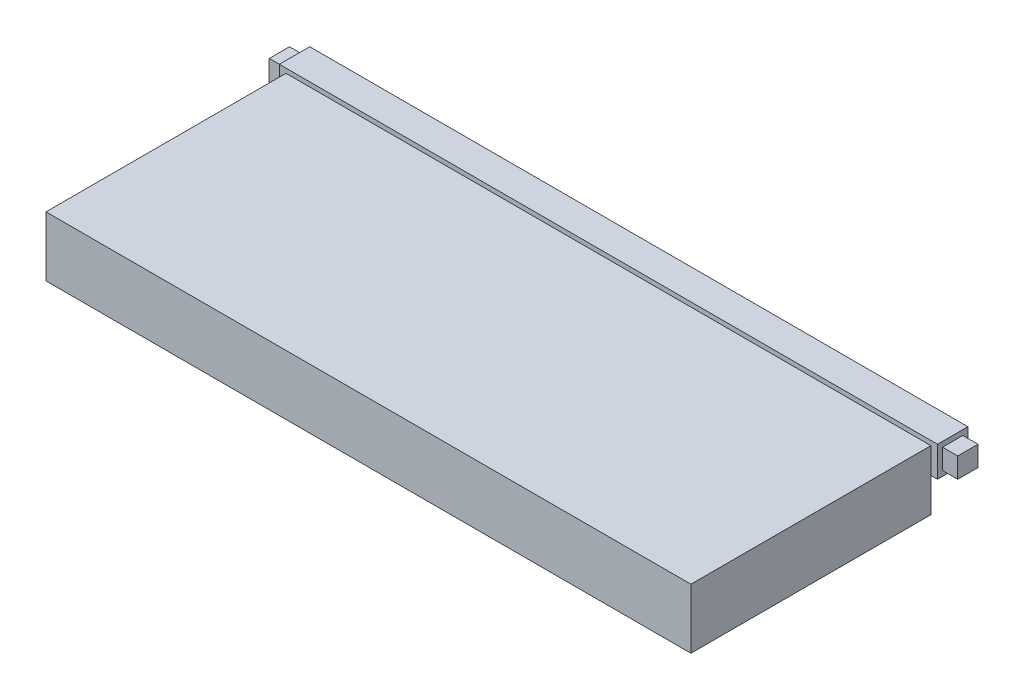
ISO-10303-21;
HEADER;
FILE_DESCRIPTION(('STEP AP214'),'2;1');
FILE_NAME('part.step','',(''),(''),'','','');
FILE_SCHEMA(('AUTOMOTIVE_DESIGN { 1 0 10303 214 1 1 1 1 }'));
ENDSEC;
DATA;
#1=APPLICATION_CONTEXT('core data for automotive mechanical design processes');
#2=APPLICATION_PROTOCOL_DEFINITION('international standard','automotive_design',2000,#1);
#3=PRODUCT_CONTEXT('',#1,'mechanical');
#4=PRODUCT('Part','Part','',(#3));
#5=PRODUCT_RELATED_PRODUCT_CATEGORY('part','',(#4));
#6=PRODUCT_DEFINITION_FORMATION('','',#4);
#7=PRODUCT_DEFINITION_CONTEXT('part definition',#1,'design');
#8=PRODUCT_DEFINITION('design','',#6,#7);
#9=PRODUCT_DEFINITION_SHAPE('','',#8);
#10=(LENGTH_UNIT() NAMED_UNIT(*) SI_UNIT(.MILLI.,.METRE.));
#11=(NAMED_UNIT(*) PLANE_ANGLE_UNIT() SI_UNIT($,.RADIAN.));
#12=(NAMED_UNIT(*) SI_UNIT($,.STERADIAN.) SOLID_ANGLE_UNIT());
#13=UNCERTAINTY_MEASURE_WITH_UNIT(LENGTH_MEASURE(1.E-05),#10,'distance_accuracy_value','');
#14=(GEOMETRIC_REPRESENTATION_CONTEXT(3) GLOBAL_UNCERTAINTY_ASSIGNED_CONTEXT((#13)) GLOBAL_UNIT_ASSIGNED_CONTEXT((#10,
#11,#12)) REPRESENTATION_CONTEXT('',''));
#15=CARTESIAN_POINT('',(0.,0.,0.));
#16=DIRECTION('',(0.,0.,1.));
#17=DIRECTION('',(1.,0.,0.));
#18=AXIS2_PLACEMENT_3D('',#15,#16,#17);
#19=CARTESIAN_POINT('',(-335.201793721973,30.,5.58856502242151));
#20=DIRECTION('',(0.,0.,-1.));
#21=DIRECTION('',(-1.,0.,0.));
#22=AXIS2_PLACEMENT_3D('',#19,#20,#21);
#23=PLANE('',#22);
#24=DIRECTION('',(1.,0.,0.));
#25=VECTOR('',#24,1.);
#26=CARTESIAN_POINT('',(-335.201793721973,0.,5.58856502242151));
#27=LINE('',#26,#25);
#28=CARTESIAN_POINT('',(-335.201793721973,0.,5.58856502242151));
#29=VERTEX_POINT('',#28);
#30=CARTESIAN_POINT('',(-328.66856520436,0.,5.58856502242151));
#31=VERTEX_POINT('',#30);
#32=EDGE_CURVE('E384',#29,#31,#27,.T.);
#33=ORIENTED_EDGE('',*,*,#32,.T.);
#34=DIRECTION('',(0.,-1.,0.));
#35=VECTOR('',#34,1.);
#36=CARTESIAN_POINT('',(-328.66856520436,25.5396027361917,5.58856502242151));
#37=LINE('',#36,#35);
#38=CARTESIAN_POINT('',(-328.66856520436,25.5396027361917,5.58856502242151));
#39=VERTEX_POINT('',#38);
#40=EDGE_CURVE('E268',#39,#31,#37,.T.);
#41=ORIENTED_EDGE('',*,*,#40,.F.);
#42=DIRECTION('',(-1.,0.,0.));
#43=VECTOR('',#42,1.);
#44=CARTESIAN_POINT('',(-328.66856520436,25.5396027361917,5.58856502242151));
#45=LINE('',#44,#43);
#46=CARTESIAN_POINT('',(308.264977760414,25.5396027361917,5.58856502242151));
#47=VERTEX_POINT('',#46);
#48=EDGE_CURVE('E63',#47,#39,#45,.T.);
#49=ORIENTED_EDGE('',*,*,#48,.F.);
#50=DIRECTION('',(0.,1.,0.));
#51=VECTOR('',#50,1.);
#52=CARTESIAN_POINT('',(308.264977760414,25.5396027361917,5.58856502242151));
#53=LINE('',#52,#51);
#54=CARTESIAN_POINT('',(308.264977760414,0.,5.58856502242151));
#55=VERTEX_POINT('',#54);
#56=EDGE_CURVE('E262',#55,#47,#53,.T.);
#57=ORIENTED_EDGE('',*,*,#56,.F.);
#58=CARTESIAN_POINT('',(314.798206278027,0.,5.58856502242151));
#59=VERTEX_POINT('',#58);
#60=EDGE_CURVE('E403',#55,#59,#27,.T.);
#61=ORIENTED_EDGE('',*,*,#60,.T.);
#62=DIRECTION('',(0.,-1.,0.));
#63=VECTOR('',#62,1.);
#64=CARTESIAN_POINT('',(314.798206278027,30.,5.58856502242151));
#65=LINE('',#64,#63);
#66=CARTESIAN_POINT('',(314.798206278027,30.,5.58856502242151));
#67=VERTEX_POINT('',#66);
#68=EDGE_CURVE('E393',#67,#59,#65,.T.);
#69=ORIENTED_EDGE('',*,*,#68,.F.);
#70=DIRECTION('',(1.,0.,0.));
#71=VECTOR('',#70,1.);
#72=CARTESIAN_POINT('',(-335.201793721973,30.,5.58856502242151));
#73=LINE('',#72,#71);
#74=CARTESIAN_POINT('',(-335.201793721973,30.,5.58856502242151));
#75=VERTEX_POINT('',#74);
#76=EDGE_CURVE('E390',#75,#67,#73,.T.);
#77=ORIENTED_EDGE('',*,*,#76,.F.);
#78=DIRECTION('',(0.,-1.,0.));
#79=VECTOR('',#78,1.);
#80=CARTESIAN_POINT('',(-335.201793721973,30.,5.58856502242151));
#81=LINE('',#80,#79);
#82=EDGE_CURVE('E410',#75,#29,#81,.T.);
#83=ORIENTED_EDGE('',*,*,#82,.T.);
#84=EDGE_LOOP('',(#33,#41,#49,#57,#61,#69,#77,#83));
#85=FACE_BOUND('',#84,.T.);
#86=ADVANCED_FACE('F39',(#85),#23,.F.);
#87=CARTESIAN_POINT('',(-335.201793721973,30.,5.58856502242151));
#88=DIRECTION('',(1.,0.,0.));
#89=DIRECTION('',(0.,0.,-1.));
#90=AXIS2_PLACEMENT_3D('',#87,#88,#89);
#91=PLANE('',#90);
#92=DIRECTION('',(0.,0.,1.));
#93=VECTOR('',#92,1.);
#94=CARTESIAN_POINT('',(-335.201793721973,0.,5.58856502242151));
#95=LINE('',#94,#93);
#96=CARTESIAN_POINT('',(-335.201793721973,0.,-24.4114349775785));
#97=VERTEX_POINT('',#96);
#98=EDGE_CURVE('E400',#97,#29,#95,.T.);
#99=ORIENTED_EDGE('',*,*,#98,.T.);
#100=ORIENTED_EDGE('',*,*,#82,.F.);
#101=DIRECTION('',(0.,0.,1.));
#102=VECTOR('',#101,1.);
#103=CARTESIAN_POINT('',(-335.201793721973,30.,5.58856502242151));
#104=LINE('',#103,#102);
#105=CARTESIAN_POINT('',(-335.201793721973,30.,-24.4114349775785));
#106=VERTEX_POINT('',#105);
#107=EDGE_CURVE('E387',#106,#75,#104,.T.);
#108=ORIENTED_EDGE('',*,*,#107,.F.);
#109=DIRECTION('',(0.,-1.,0.));
#110=VECTOR('',#109,1.);
#111=CARTESIAN_POINT('',(-335.201793721973,30.,-24.4114349775785));
#112=LINE('',#111,#110);
#113=EDGE_CURVE('E48',#106,#97,#112,.T.);
#114=ORIENTED_EDGE('',*,*,#113,.T.);
#115=EDGE_LOOP('',(#99,#100,#108,#114));
#116=FACE_BOUND('',#115,.T.);
#117=DIRECTION('',(0.,1.,0.));
#118=VECTOR('',#117,1.);
#119=CARTESIAN_POINT('',(-335.201793721973,5.,0.588565022421513));
#120=LINE('',#119,#118);
#121=CARTESIAN_POINT('',(-335.201793721973,5.,0.588565022421513));
#122=VERTEX_POINT('',#121);
#123=CARTESIAN_POINT('',(-335.201793721973,25.,0.588565022421513));
#124=VERTEX_POINT('',#123);
#125=EDGE_CURVE('E288',#122,#124,#120,.T.);
#126=ORIENTED_EDGE('',*,*,#125,.F.);
#127=DIRECTION('',(0.,0.,1.));
#128=VECTOR('',#127,1.);
#129=CARTESIAN_POINT('',(-335.201793721973,5.,-19.4114349775785));
#130=LINE('',#129,#128);
#131=CARTESIAN_POINT('',(-335.201793721973,5.,-19.4114349775785));
#132=VERTEX_POINT('',#131);
#133=EDGE_CURVE('E294',#132,#122,#130,.T.);
#134=ORIENTED_EDGE('',*,*,#133,.F.);
#135=DIRECTION('',(0.,-1.,0.));
#136=VECTOR('',#135,1.);
#137=CARTESIAN_POINT('',(-335.201793721973,5.,-19.4114349775785));
#138=LINE('',#137,#136);
#139=CARTESIAN_POINT('',(-335.201793721973,25.,-19.4114349775785));
#140=VERTEX_POINT('',#139);
#141=EDGE_CURVE('E311',#140,#132,#138,.T.);
#142=ORIENTED_EDGE('',*,*,#141,.F.);
#143=DIRECTION('',(0.,0.,-1.));
#144=VECTOR('',#143,1.);
#145=CARTESIAN_POINT('',(-335.201793721973,25.,-19.4114349775785));
#146=LINE('',#145,#144);
#147=EDGE_CURVE('E307',#124,#140,#146,.T.);
#148=ORIENTED_EDGE('',*,*,#147,.F.);
#149=EDGE_LOOP('',(#126,#134,#142,#148));
#150=FACE_BOUND('',#149,.T.);
#151=ADVANCED_FACE('F419',(#116,#150),#91,.F.);
#152=CARTESIAN_POINT('',(314.798206278027,30.,5.58856502242151));
#153=DIRECTION('',(-1.,0.,0.));
#154=DIRECTION('',(0.,0.,1.));
#155=AXIS2_PLACEMENT_3D('',#152,#153,#154);
#156=PLANE('',#155);
#157=DIRECTION('',(0.,0.,-1.));
#158=VECTOR('',#157,1.);
#159=CARTESIAN_POINT('',(314.798206278027,0.,5.58856502242151));
#160=LINE('',#159,#158);
#161=CARTESIAN_POINT('',(314.798206278027,0.,-24.4114349775785));
#162=VERTEX_POINT('',#161);
#163=EDGE_CURVE('E378',#59,#162,#160,.T.);
#164=ORIENTED_EDGE('',*,*,#163,.T.);
#165=DIRECTION('',(0.,-1.,0.));
#166=VECTOR('',#165,1.);
#167=CARTESIAN_POINT('',(314.798206278027,30.,-24.4114349775785));
#168=LINE('',#167,#166);
#169=CARTESIAN_POINT('',(314.798206278027,30.,-24.4114349775785));
#170=VERTEX_POINT('',#169);
#171=EDGE_CURVE('E11',#170,#162,#168,.T.);
#172=ORIENTED_EDGE('',*,*,#171,.F.);
#173=DIRECTION('',(0.,0.,-1.));
#174=VECTOR('',#173,1.);
#175=CARTESIAN_POINT('',(314.798206278027,30.,5.58856502242151));
#176=LINE('',#175,#174);
#177=EDGE_CURVE('E379',#67,#170,#176,.T.);
#178=ORIENTED_EDGE('',*,*,#177,.F.);
#179=ORIENTED_EDGE('',*,*,#68,.T.);
#180=EDGE_LOOP('',(#164,#172,#178,#179));
#181=FACE_BOUND('',#180,.T.);
#182=DIRECTION('',(0.,1.,0.));
#183=VECTOR('',#182,1.);
#184=CARTESIAN_POINT('',(314.798206278027,25.,-19.4114349775785));
#185=LINE('',#184,#183);
#186=CARTESIAN_POINT('',(314.798206278027,5.,-19.4114349775785));
#187=VERTEX_POINT('',#186);
#188=CARTESIAN_POINT('',(314.798206278027,25.,-19.4114349775785));
#189=VERTEX_POINT('',#188);
#190=EDGE_CURVE('E333',#187,#189,#185,.T.);
#191=ORIENTED_EDGE('',*,*,#190,.F.);
#192=DIRECTION('',(0.,0.,-1.));
#193=VECTOR('',#192,1.);
#194=CARTESIAN_POINT('',(314.798206278027,5.,0.588565022421512));
#195=LINE('',#194,#193);
#196=CARTESIAN_POINT('',(314.798206278027,5.,0.588565022421512));
#197=VERTEX_POINT('',#196);
#198=EDGE_CURVE('E339',#197,#187,#195,.T.);
#199=ORIENTED_EDGE('',*,*,#198,.F.);
#200=DIRECTION('',(0.,-1.,0.));
#201=VECTOR('',#200,1.);
#202=CARTESIAN_POINT('',(314.798206278027,25.,0.588565022421514));
#203=LINE('',#202,#201);
#204=CARTESIAN_POINT('',(314.798206278027,25.,0.588565022421514));
#205=VERTEX_POINT('',#204);
#206=EDGE_CURVE('E356',#205,#197,#203,.T.);
#207=ORIENTED_EDGE('',*,*,#206,.F.);
#208=DIRECTION('',(0.,0.,1.));
#209=VECTOR('',#208,1.);
#210=CARTESIAN_POINT('',(314.798206278027,25.,0.588565022421514));
#211=LINE('',#210,#209);
#212=EDGE_CURVE('E352',#189,#205,#211,.T.);
#213=ORIENTED_EDGE('',*,*,#212,.F.);
#214=EDGE_LOOP('',(#191,#199,#207,#213));
#215=FACE_BOUND('',#214,.T.);
#216=ADVANCED_FACE('F41',(#181,#215),#156,.F.);
#217=CARTESIAN_POINT('',(-335.201793721973,30.,-24.4114349775785));
#218=DIRECTION('',(0.,0.,1.));
#219=DIRECTION('',(1.,0.,0.));
#220=AXIS2_PLACEMENT_3D('',#217,#218,#219);
#221=PLANE('',#220);
#222=DIRECTION('',(-1.,0.,0.));
#223=VECTOR('',#222,1.);
#224=CARTESIAN_POINT('',(-335.201793721973,0.,-24.4114349775785));
#225=LINE('',#224,#223);
#226=EDGE_CURVE('E397',#162,#97,#225,.T.);
#227=ORIENTED_EDGE('',*,*,#226,.T.);
#228=ORIENTED_EDGE('',*,*,#113,.F.);
#229=DIRECTION('',(-1.,0.,0.));
#230=VECTOR('',#229,1.);
#231=CARTESIAN_POINT('',(-335.201793721973,30.,-24.4114349775785));
#232=LINE('',#231,#230);
#233=EDGE_CURVE('E383',#170,#106,#232,.T.);
#234=ORIENTED_EDGE('',*,*,#233,.F.);
#235=ORIENTED_EDGE('',*,*,#171,.T.);
#236=EDGE_LOOP('',(#227,#228,#234,#235));
#237=FACE_BOUND('',#236,.T.);
#238=ADVANCED_FACE('F435',(#237),#221,.F.);
#239=CARTESIAN_POINT('',(0.,30.,0.));
#240=DIRECTION('',(0.,-1.,0.));
#241=DIRECTION('',(0.,0.,-1.));
#242=AXIS2_PLACEMENT_3D('',#239,#240,#241);
#243=PLANE('',#242);
#244=ORIENTED_EDGE('',*,*,#177,.T.);
#245=ORIENTED_EDGE('',*,*,#233,.T.);
#246=ORIENTED_EDGE('',*,*,#107,.T.);
#247=ORIENTED_EDGE('',*,*,#76,.T.);
#248=EDGE_LOOP('',(#244,#245,#246,#247));
#249=FACE_BOUND('',#248,.T.);
#250=ADVANCED_FACE('F433',(#249),#243,.F.);
#251=CARTESIAN_POINT('',(0.,0.,0.));
#252=DIRECTION('',(0.,-1.,0.));
#253=DIRECTION('',(0.,0.,-1.));
#254=AXIS2_PLACEMENT_3D('',#251,#252,#253);
#255=PLANE('',#254);
#256=ORIENTED_EDGE('',*,*,#163,.F.);
#257=ORIENTED_EDGE('',*,*,#60,.F.);
#258=DIRECTION('',(-1.,0.,0.));
#259=VECTOR('',#258,1.);
#260=CARTESIAN_POINT('',(0.,0.,5.58856502242151));
#261=LINE('',#260,#259);
#262=EDGE_CURVE('E258',#55,#31,#261,.T.);
#263=ORIENTED_EDGE('',*,*,#262,.T.);
#264=ORIENTED_EDGE('',*,*,#32,.F.);
#265=ORIENTED_EDGE('',*,*,#98,.F.);
#266=ORIENTED_EDGE('',*,*,#226,.F.);
#267=EDGE_LOOP('',(#256,#257,#263,#264,#265,#266));
#268=FACE_BOUND('',#267,.T.);
#269=ADVANCED_FACE('F426',(#268),#255,.T.);
#270=CARTESIAN_POINT('',(329.798206278027,25.,-19.4114349775785));
#271=DIRECTION('',(0.,0.,1.));
#272=DIRECTION('',(0.,-1.,0.));
#273=AXIS2_PLACEMENT_3D('',#270,#271,#272);
#274=PLANE('',#273);
#275=ORIENTED_EDGE('',*,*,#190,.T.);
#276=DIRECTION('',(-1.,0.,0.));
#277=VECTOR('',#276,1.);
#278=CARTESIAN_POINT('',(329.798206278027,25.,-19.4114349775785));
#279=LINE('',#278,#277);
#280=CARTESIAN_POINT('',(329.798206278027,25.,-19.4114349775785));
#281=VERTEX_POINT('',#280);
#282=EDGE_CURVE('E374',#281,#189,#279,.T.);
#283=ORIENTED_EDGE('',*,*,#282,.F.);
#284=DIRECTION('',(0.,1.,0.));
#285=VECTOR('',#284,1.);
#286=CARTESIAN_POINT('',(329.798206278027,25.,-19.4114349775785));
#287=LINE('',#286,#285);
#288=CARTESIAN_POINT('',(329.798206278027,5.,-19.4114349775785));
#289=VERTEX_POINT('',#288);
#290=EDGE_CURVE('E334',#289,#281,#287,.T.);
#291=ORIENTED_EDGE('',*,*,#290,.F.);
#292=DIRECTION('',(-1.,0.,0.));
#293=VECTOR('',#292,1.);
#294=CARTESIAN_POINT('',(329.798206278027,5.,-19.4114349775785));
#295=LINE('',#294,#293);
#296=EDGE_CURVE('E348',#289,#187,#295,.T.);
#297=ORIENTED_EDGE('',*,*,#296,.T.);
#298=EDGE_LOOP('',(#275,#283,#291,#297));
#299=FACE_BOUND('',#298,.T.);
#300=ADVANCED_FACE('F564',(#299),#274,.F.);
#301=CARTESIAN_POINT('',(329.798206278027,25.,0.588565022421514));
#302=DIRECTION('',(0.,-1.,0.));
#303=DIRECTION('',(0.,0.,-1.));
#304=AXIS2_PLACEMENT_3D('',#301,#302,#303);
#305=PLANE('',#304);
#306=ORIENTED_EDGE('',*,*,#212,.T.);
#307=DIRECTION('',(-1.,0.,0.));
#308=VECTOR('',#307,1.);
#309=CARTESIAN_POINT('',(329.798206278027,25.,0.588565022421514));
#310=LINE('',#309,#308);
#311=CARTESIAN_POINT('',(329.798206278027,25.,0.588565022421514));
#312=VERTEX_POINT('',#311);
#313=EDGE_CURVE('E370',#312,#205,#310,.T.);
#314=ORIENTED_EDGE('',*,*,#313,.F.);
#315=DIRECTION('',(0.,0.,1.));
#316=VECTOR('',#315,1.);
#317=CARTESIAN_POINT('',(329.798206278027,25.,0.588565022421514));
#318=LINE('',#317,#316);
#319=EDGE_CURVE('E338',#281,#312,#318,.T.);
#320=ORIENTED_EDGE('',*,*,#319,.F.);
#321=ORIENTED_EDGE('',*,*,#282,.T.);
#322=EDGE_LOOP('',(#306,#314,#320,#321));
#323=FACE_BOUND('',#322,.T.);
#324=ADVANCED_FACE('F659',(#323),#305,.F.);
#325=CARTESIAN_POINT('',(329.798206278027,25.,0.588565022421514));
#326=DIRECTION('',(0.,0.,-1.));
#327=DIRECTION('',(0.,1.,0.));
#328=AXIS2_PLACEMENT_3D('',#325,#326,#327);
#329=PLANE('',#328);
#330=ORIENTED_EDGE('',*,*,#206,.T.);
#331=DIRECTION('',(-1.,0.,0.));
#332=VECTOR('',#331,1.);
#333=CARTESIAN_POINT('',(329.798206278027,5.,0.588565022421512));
#334=LINE('',#333,#332);
#335=CARTESIAN_POINT('',(329.798206278027,5.,0.588565022421512));
#336=VERTEX_POINT('',#335);
#337=EDGE_CURVE('E366',#336,#197,#334,.T.);
#338=ORIENTED_EDGE('',*,*,#337,.F.);
#339=DIRECTION('',(0.,-1.,0.));
#340=VECTOR('',#339,1.);
#341=CARTESIAN_POINT('',(329.798206278027,25.,0.588565022421514));
#342=LINE('',#341,#340);
#343=EDGE_CURVE('E342',#312,#336,#342,.T.);
#344=ORIENTED_EDGE('',*,*,#343,.F.);
#345=ORIENTED_EDGE('',*,*,#313,.T.);
#346=EDGE_LOOP('',(#330,#338,#344,#345));
#347=FACE_BOUND('',#346,.T.);
#348=ADVANCED_FACE('F667',(#347),#329,.F.);
#349=CARTESIAN_POINT('',(329.798206278027,5.,0.588565022421512));
#350=DIRECTION('',(0.,1.,0.));
#351=DIRECTION('',(0.,0.,1.));
#352=AXIS2_PLACEMENT_3D('',#349,#350,#351);
#353=PLANE('',#352);
#354=ORIENTED_EDGE('',*,*,#198,.T.);
#355=ORIENTED_EDGE('',*,*,#296,.F.);
#356=DIRECTION('',(0.,0.,-1.));
#357=VECTOR('',#356,1.);
#358=CARTESIAN_POINT('',(329.798206278027,5.,0.588565022421512));
#359=LINE('',#358,#357);
#360=EDGE_CURVE('E345',#336,#289,#359,.T.);
#361=ORIENTED_EDGE('',*,*,#360,.F.);
#362=ORIENTED_EDGE('',*,*,#337,.T.);
#363=EDGE_LOOP('',(#354,#355,#361,#362));
#364=FACE_BOUND('',#363,.T.);
#365=ADVANCED_FACE('F675',(#364),#353,.F.);
#366=CARTESIAN_POINT('',(329.798206278027,0.,0.));
#367=DIRECTION('',(1.,0.,0.));
#368=DIRECTION('',(0.,0.,-1.));
#369=AXIS2_PLACEMENT_3D('',#366,#367,#368);
#370=PLANE('',#369);
#371=ORIENTED_EDGE('',*,*,#290,.T.);
#372=ORIENTED_EDGE('',*,*,#319,.T.);
#373=ORIENTED_EDGE('',*,*,#343,.T.);
#374=ORIENTED_EDGE('',*,*,#360,.T.);
#375=EDGE_LOOP('',(#371,#372,#373,#374));
#376=FACE_BOUND('',#375,.T.);
#377=ADVANCED_FACE('F496',(#376),#370,.T.);
#378=CARTESIAN_POINT('',(-350.201793721973,5.,0.588565022421541));
#379=DIRECTION('',(0.,0.,-1.));
#380=DIRECTION('',(-1.,0.,0.));
#381=AXIS2_PLACEMENT_3D('',#378,#379,#380);
#382=PLANE('',#381);
#383=ORIENTED_EDGE('',*,*,#125,.T.);
#384=DIRECTION('',(1.,0.,0.));
#385=VECTOR('',#384,1.);
#386=CARTESIAN_POINT('',(-350.201793721973,25.,0.588565022421541));
#387=LINE('',#386,#385);
#388=CARTESIAN_POINT('',(-350.201793721973,25.,0.588565022421541));
#389=VERTEX_POINT('',#388);
#390=EDGE_CURVE('E329',#389,#124,#387,.T.);
#391=ORIENTED_EDGE('',*,*,#390,.F.);
#392=DIRECTION('',(0.,1.,0.));
#393=VECTOR('',#392,1.);
#394=CARTESIAN_POINT('',(-350.201793721973,5.,0.588565022421541));
#395=LINE('',#394,#393);
#396=CARTESIAN_POINT('',(-350.201793721973,5.,0.588565022421541));
#397=VERTEX_POINT('',#396);
#398=EDGE_CURVE('E289',#397,#389,#395,.T.);
#399=ORIENTED_EDGE('',*,*,#398,.F.);
#400=DIRECTION('',(1.,0.,0.));
#401=VECTOR('',#400,1.);
#402=CARTESIAN_POINT('',(-350.201793721973,5.,0.588565022421541));
#403=LINE('',#402,#401);
#404=EDGE_CURVE('E303',#397,#122,#403,.T.);
#405=ORIENTED_EDGE('',*,*,#404,.T.);
#406=EDGE_LOOP('',(#383,#391,#399,#405));
#407=FACE_BOUND('',#406,.T.);
#408=ADVANCED_FACE('F500',(#407),#382,.F.);
#409=CARTESIAN_POINT('',(-350.201793721973,25.,-19.4114349775785));
#410=DIRECTION('',(0.,-1.,0.));
#411=DIRECTION('',(0.,0.,-1.));
#412=AXIS2_PLACEMENT_3D('',#409,#410,#411);
#413=PLANE('',#412);
#414=ORIENTED_EDGE('',*,*,#147,.T.);
#415=DIRECTION('',(1.,0.,0.));
#416=VECTOR('',#415,1.);
#417=CARTESIAN_POINT('',(-350.201793721973,25.,-19.4114349775785));
#418=LINE('',#417,#416);
#419=CARTESIAN_POINT('',(-350.201793721973,25.,-19.4114349775785));
#420=VERTEX_POINT('',#419);
#421=EDGE_CURVE('E325',#420,#140,#418,.T.);
#422=ORIENTED_EDGE('',*,*,#421,.F.);
#423=DIRECTION('',(0.,0.,-1.));
#424=VECTOR('',#423,1.);
#425=CARTESIAN_POINT('',(-350.201793721973,25.,-19.4114349775785));
#426=LINE('',#425,#424);
#427=EDGE_CURVE('E293',#389,#420,#426,.T.);
#428=ORIENTED_EDGE('',*,*,#427,.F.);
#429=ORIENTED_EDGE('',*,*,#390,.T.);
#430=EDGE_LOOP('',(#414,#422,#428,#429));
#431=FACE_BOUND('',#430,.T.);
#432=ADVANCED_FACE('F504',(#431),#413,.F.);
#433=CARTESIAN_POINT('',(-350.201793721973,5.,-19.4114349775785));
#434=DIRECTION('',(0.,0.,1.));
#435=DIRECTION('',(1.,0.,0.));
#436=AXIS2_PLACEMENT_3D('',#433,#434,#435);
#437=PLANE('',#436);
#438=ORIENTED_EDGE('',*,*,#141,.T.);
#439=DIRECTION('',(1.,0.,0.));
#440=VECTOR('',#439,1.);
#441=CARTESIAN_POINT('',(-350.201793721973,5.,-19.4114349775785));
#442=LINE('',#441,#440);
#443=CARTESIAN_POINT('',(-350.201793721973,5.,-19.4114349775785));
#444=VERTEX_POINT('',#443);
#445=EDGE_CURVE('E321',#444,#132,#442,.T.);
#446=ORIENTED_EDGE('',*,*,#445,.F.);
#447=DIRECTION('',(0.,-1.,0.));
#448=VECTOR('',#447,1.);
#449=CARTESIAN_POINT('',(-350.201793721973,5.,-19.4114349775785));
#450=LINE('',#449,#448);
#451=EDGE_CURVE('E297',#420,#444,#450,.T.);
#452=ORIENTED_EDGE('',*,*,#451,.F.);
#453=ORIENTED_EDGE('',*,*,#421,.T.);
#454=EDGE_LOOP('',(#438,#446,#452,#453));
#455=FACE_BOUND('',#454,.T.);
#456=ADVANCED_FACE('F514',(#455),#437,.F.);
#457=CARTESIAN_POINT('',(-350.201793721973,5.,-19.4114349775785));
#458=DIRECTION('',(0.,1.,0.));
#459=DIRECTION('',(0.,0.,1.));
#460=AXIS2_PLACEMENT_3D('',#457,#458,#459);
#461=PLANE('',#460);
#462=ORIENTED_EDGE('',*,*,#133,.T.);
#463=ORIENTED_EDGE('',*,*,#404,.F.);
#464=DIRECTION('',(0.,0.,1.));
#465=VECTOR('',#464,1.);
#466=CARTESIAN_POINT('',(-350.201793721973,5.,-19.4114349775785));
#467=LINE('',#466,#465);
#468=EDGE_CURVE('E300',#444,#397,#467,.T.);
#469=ORIENTED_EDGE('',*,*,#468,.F.);
#470=ORIENTED_EDGE('',*,*,#445,.T.);
#471=EDGE_LOOP('',(#462,#463,#469,#470));
#472=FACE_BOUND('',#471,.T.);
#473=ADVANCED_FACE('F524',(#472),#461,.F.);
#474=CARTESIAN_POINT('',(-350.201793721973,0.,9.58127448830096E-13));
#475=DIRECTION('',(1.,0.,0.));
#476=DIRECTION('',(0.,0.,-1.));
#477=AXIS2_PLACEMENT_3D('',#474,#475,#476);
#478=PLANE('',#477);
#479=ORIENTED_EDGE('',*,*,#398,.T.);
#480=ORIENTED_EDGE('',*,*,#427,.T.);
#481=ORIENTED_EDGE('',*,*,#451,.T.);
#482=ORIENTED_EDGE('',*,*,#468,.T.);
#483=EDGE_LOOP('',(#479,#480,#481,#482));
#484=FACE_BOUND('',#483,.T.);
#485=ADVANCED_FACE('F465',(#484),#478,.F.);
#486=CARTESIAN_POINT('',(308.264977760414,25.5396027361917,242.588565022422));
#487=DIRECTION('',(-1.,0.,0.));
#488=DIRECTION('',(0.,0.,1.));
#489=AXIS2_PLACEMENT_3D('',#486,#487,#488);
#490=PLANE('',#489);
#491=ORIENTED_EDGE('',*,*,#56,.T.);
#492=DIRECTION('',(0.,0.,-1.));
#493=VECTOR('',#492,1.);
#494=CARTESIAN_POINT('',(308.264977760414,25.5396027361917,242.588565022422));
#495=LINE('',#494,#493);
#496=CARTESIAN_POINT('',(308.264977760414,25.5396027361917,242.588565022422));
#497=VERTEX_POINT('',#496);
#498=EDGE_CURVE('E285',#497,#47,#495,.T.);
#499=ORIENTED_EDGE('',*,*,#498,.F.);
#500=DIRECTION('',(0.,1.,0.));
#501=VECTOR('',#500,1.);
#502=CARTESIAN_POINT('',(308.264977760414,25.5396027361917,242.588565022422));
#503=LINE('',#502,#501);
#504=CARTESIAN_POINT('',(308.264977760414,-33.5396027361918,242.588565022422));
#505=VERTEX_POINT('',#504);
#506=EDGE_CURVE('E263',#505,#497,#503,.T.);
#507=ORIENTED_EDGE('',*,*,#506,.F.);
#508=DIRECTION('',(0.,0.,1.));
#509=VECTOR('',#508,1.);
#510=CARTESIAN_POINT('',(308.264977760414,-33.5396027361918,5.58856502242151));
#511=LINE('',#510,#509);
#512=CARTESIAN_POINT('',(308.264977760414,-33.5396027361918,5.58856502242151));
#513=VERTEX_POINT('',#512);
#514=EDGE_CURVE('E242',#513,#505,#511,.T.);
#515=ORIENTED_EDGE('',*,*,#514,.F.);
#516=DIRECTION('',(0.,1.,0.));
#517=VECTOR('',#516,1.);
#518=CARTESIAN_POINT('',(308.264977760414,-33.5396027361918,5.58856502242151));
#519=LINE('',#518,#517);
#520=EDGE_CURVE('E250',#513,#55,#519,.T.);
#521=ORIENTED_EDGE('',*,*,#520,.T.);
#522=EDGE_LOOP('',(#491,#499,#507,#515,#521));
#523=FACE_BOUND('',#522,.T.);
#524=ADVANCED_FACE('F446',(#523),#490,.F.);
#525=CARTESIAN_POINT('',(-328.66856520436,25.5396027361917,242.588565022422));
#526=DIRECTION('',(0.,-1.,0.));
#527=DIRECTION('',(0.,0.,-1.));
#528=AXIS2_PLACEMENT_3D('',#525,#526,#527);
#529=PLANE('',#528);
#530=ORIENTED_EDGE('',*,*,#48,.T.);
#531=DIRECTION('',(0.,0.,-1.));
#532=VECTOR('',#531,1.);
#533=CARTESIAN_POINT('',(-328.66856520436,25.5396027361917,242.588565022422));
#534=LINE('',#533,#532);
#535=CARTESIAN_POINT('',(-328.66856520436,25.5396027361917,242.588565022422));
#536=VERTEX_POINT('',#535);
#537=EDGE_CURVE('E274',#536,#39,#534,.T.);
#538=ORIENTED_EDGE('',*,*,#537,.F.);
#539=DIRECTION('',(-1.,0.,0.));
#540=VECTOR('',#539,1.);
#541=CARTESIAN_POINT('',(-328.66856520436,25.5396027361917,242.588565022422));
#542=LINE('',#541,#540);
#543=EDGE_CURVE('E267',#497,#536,#542,.T.);
#544=ORIENTED_EDGE('',*,*,#543,.F.);
#545=ORIENTED_EDGE('',*,*,#498,.T.);
#546=EDGE_LOOP('',(#530,#538,#544,#545));
#547=FACE_BOUND('',#546,.T.);
#548=ADVANCED_FACE('F457',(#547),#529,.F.);
#549=CARTESIAN_POINT('',(-328.66856520436,25.5396027361917,242.588565022422));
#550=DIRECTION('',(1.,0.,0.));
#551=DIRECTION('',(0.,0.,-1.));
#552=AXIS2_PLACEMENT_3D('',#549,#550,#551);
#553=PLANE('',#552);
#554=ORIENTED_EDGE('',*,*,#40,.T.);
#555=DIRECTION('',(0.,1.,0.));
#556=VECTOR('',#555,1.);
#557=CARTESIAN_POINT('',(-328.66856520436,-33.5396027361918,5.58856502242151));
#558=LINE('',#557,#556);
#559=CARTESIAN_POINT('',(-328.66856520436,-33.5396027361918,5.58856502242151));
#560=VERTEX_POINT('',#559);
#561=EDGE_CURVE('E254',#560,#31,#558,.T.);
#562=ORIENTED_EDGE('',*,*,#561,.F.);
#563=DIRECTION('',(0.,0.,-1.));
#564=VECTOR('',#563,1.);
#565=CARTESIAN_POINT('',(-328.66856520436,-33.5396027361918,242.588565022422));
#566=LINE('',#565,#564);
#567=CARTESIAN_POINT('',(-328.66856520436,-33.5396027361918,242.588565022422));
#568=VERTEX_POINT('',#567);
#569=EDGE_CURVE('E202',#568,#560,#566,.T.);
#570=ORIENTED_EDGE('',*,*,#569,.F.);
#571=DIRECTION('',(0.,-1.,0.));
#572=VECTOR('',#571,1.);
#573=CARTESIAN_POINT('',(-328.66856520436,25.5396027361917,242.588565022422));
#574=LINE('',#573,#572);
#575=EDGE_CURVE('E271',#536,#568,#574,.T.);
#576=ORIENTED_EDGE('',*,*,#575,.F.);
#577=ORIENTED_EDGE('',*,*,#537,.T.);
#578=EDGE_LOOP('',(#554,#562,#570,#576,#577));
#579=FACE_BOUND('',#578,.T.);
#580=ADVANCED_FACE('F455',(#579),#553,.F.);
#581=CARTESIAN_POINT('',(0.,0.,242.588565022422));
#582=DIRECTION('',(0.,0.,1.));
#583=DIRECTION('',(1.,0.,0.));
#584=AXIS2_PLACEMENT_3D('',#581,#582,#583);
#585=PLANE('',#584);
#586=ORIENTED_EDGE('',*,*,#506,.T.);
#587=ORIENTED_EDGE('',*,*,#543,.T.);
#588=ORIENTED_EDGE('',*,*,#575,.T.);
#589=DIRECTION('',(-1.,0.,0.));
#590=VECTOR('',#589,1.);
#591=CARTESIAN_POINT('',(308.264977760414,-33.5396027361918,242.588565022422));
#592=LINE('',#591,#590);
#593=EDGE_CURVE('E246',#505,#568,#592,.T.);
#594=ORIENTED_EDGE('',*,*,#593,.F.);
#595=EDGE_LOOP('',(#586,#587,#588,#594));
#596=FACE_BOUND('',#595,.T.);
#597=ADVANCED_FACE('F451',(#596),#585,.T.);
#598=CARTESIAN_POINT('',(0.,-33.5396027361918,0.));
#599=DIRECTION('',(0.,-1.,0.));
#600=DIRECTION('',(0.,0.,-1.));
#601=AXIS2_PLACEMENT_3D('',#598,#599,#600);
#602=PLANE('',#601);
#603=ORIENTED_EDGE('',*,*,#569,.T.);
#604=DIRECTION('',(1.,0.,0.));
#605=VECTOR('',#604,1.);
#606=CARTESIAN_POINT('',(-328.66856520436,-33.5396027361918,5.58856502242151));
#607=LINE('',#606,#605);
#608=EDGE_CURVE('E239',#560,#513,#607,.T.);
#609=ORIENTED_EDGE('',*,*,#608,.T.);
#610=ORIENTED_EDGE('',*,*,#514,.T.);
#611=ORIENTED_EDGE('',*,*,#593,.T.);
#612=EDGE_LOOP('',(#603,#609,#610,#611));
#613=FACE_BOUND('',#612,.T.);
#614=DIRECTION('',(1.,0.,0.));
#615=VECTOR('',#614,1.);
#616=CARTESIAN_POINT('',(-318.66856520436,-33.5396027361918,15.5885650224215));
#617=LINE('',#616,#615);
#618=CARTESIAN_POINT('',(-318.66856520436,-33.5396027361918,15.5885650224215));
#619=VERTEX_POINT('',#618);
#620=CARTESIAN_POINT('',(298.264977760414,-33.5396027361918,15.5885650224215));
#621=VERTEX_POINT('',#620);
#622=EDGE_CURVE('E193',#619,#621,#617,.T.);
#623=ORIENTED_EDGE('',*,*,#622,.F.);
#624=DIRECTION('',(0.,0.,-1.));
#625=VECTOR('',#624,1.);
#626=CARTESIAN_POINT('',(-318.66856520436,-33.5396027361918,232.588565022422));
#627=LINE('',#626,#625);
#628=CARTESIAN_POINT('',(-318.66856520436,-33.5396027361918,232.588565022422));
#629=VERTEX_POINT('',#628);
#630=EDGE_CURVE('E184',#629,#619,#627,.T.);
#631=ORIENTED_EDGE('',*,*,#630,.F.);
#632=DIRECTION('',(-1.,0.,0.));
#633=VECTOR('',#632,1.);
#634=CARTESIAN_POINT('',(298.264977760414,-33.5396027361918,232.588565022422));
#635=LINE('',#634,#633);
#636=CARTESIAN_POINT('',(298.264977760414,-33.5396027361918,232.588565022422));
#637=VERTEX_POINT('',#636);
#638=EDGE_CURVE('E212',#637,#629,#635,.T.);
#639=ORIENTED_EDGE('',*,*,#638,.F.);
#640=DIRECTION('',(0.,0.,1.));
#641=VECTOR('',#640,1.);
#642=CARTESIAN_POINT('',(298.264977760414,-33.5396027361918,15.5885650224215));
#643=LINE('',#642,#641);
#644=EDGE_CURVE('E208',#621,#637,#643,.T.);
#645=ORIENTED_EDGE('',*,*,#644,.F.);
#646=EDGE_LOOP('',(#623,#631,#639,#645));
#647=FACE_BOUND('',#646,.T.);
#648=ADVANCED_FACE('F206',(#613,#647),#602,.T.);
#649=CARTESIAN_POINT('',(-328.66856520436,-33.5396027361918,5.58856502242151));
#650=DIRECTION('',(0.,0.,1.));
#651=DIRECTION('',(1.,0.,0.));
#652=AXIS2_PLACEMENT_3D('',#649,#650,#651);
#653=PLANE('',#652);
#654=ORIENTED_EDGE('',*,*,#262,.F.);
#655=ORIENTED_EDGE('',*,*,#520,.F.);
#656=ORIENTED_EDGE('',*,*,#608,.F.);
#657=ORIENTED_EDGE('',*,*,#561,.T.);
#658=EDGE_LOOP('',(#654,#655,#656,#657));
#659=FACE_BOUND('',#658,.T.);
#660=ADVANCED_FACE('F443',(#659),#653,.F.);
#661=CARTESIAN_POINT('',(-318.66856520436,-33.5396027361918,232.588565022422));
#662=DIRECTION('',(1.,0.,0.));
#663=DIRECTION('',(0.,0.,-1.));
#664=AXIS2_PLACEMENT_3D('',#661,#662,#663);
#665=PLANE('',#664);
#666=DIRECTION('',(0.,0.,-1.));
#667=VECTOR('',#666,1.);
#668=CARTESIAN_POINT('',(-318.66856520436,4.46039726380828,232.588565022422));
#669=LINE('',#668,#667);
#670=CARTESIAN_POINT('',(-318.66856520436,4.46039726380828,232.588565022422));
#671=VERTEX_POINT('',#670);
#672=CARTESIAN_POINT('',(-318.66856520436,4.46039726380828,15.5885650224215));
#673=VERTEX_POINT('',#672);
#674=EDGE_CURVE('E217',#671,#673,#669,.T.);
#675=ORIENTED_EDGE('',*,*,#674,.F.);
#676=DIRECTION('',(0.,1.,0.));
#677=VECTOR('',#676,1.);
#678=CARTESIAN_POINT('',(-318.66856520436,-33.5396027361918,232.588565022422));
#679=LINE('',#678,#677);
#680=EDGE_CURVE('E55',#629,#671,#679,.T.);
#681=ORIENTED_EDGE('',*,*,#680,.F.);
#682=ORIENTED_EDGE('',*,*,#630,.T.);
#683=DIRECTION('',(0.,1.,0.));
#684=VECTOR('',#683,1.);
#685=CARTESIAN_POINT('',(-318.66856520436,-33.5396027361918,15.5885650224215));
#686=LINE('',#685,#684);
#687=EDGE_CURVE('E187',#619,#673,#686,.T.);
#688=ORIENTED_EDGE('',*,*,#687,.T.);
#689=EDGE_LOOP('',(#675,#681,#682,#688));
#690=FACE_BOUND('',#689,.T.);
#691=ADVANCED_FACE('F186',(#690),#665,.T.);
#692=CARTESIAN_POINT('',(-318.66856520436,-33.5396027361918,15.5885650224215));
#693=DIRECTION('',(0.,0.,1.));
#694=DIRECTION('',(1.,0.,0.));
#695=AXIS2_PLACEMENT_3D('',#692,#693,#694);
#696=PLANE('',#695);
#697=DIRECTION('',(1.,0.,0.));
#698=VECTOR('',#697,1.);
#699=CARTESIAN_POINT('',(-318.66856520436,4.46039726380828,15.5885650224215));
#700=LINE('',#699,#698);
#701=CARTESIAN_POINT('',(298.264977760414,4.46039726380828,15.5885650224215));
#702=VERTEX_POINT('',#701);
#703=EDGE_CURVE('E200',#673,#702,#700,.T.);
#704=ORIENTED_EDGE('',*,*,#703,.F.);
#705=ORIENTED_EDGE('',*,*,#687,.F.);
#706=ORIENTED_EDGE('',*,*,#622,.T.);
#707=DIRECTION('',(0.,1.,0.));
#708=VECTOR('',#707,1.);
#709=CARTESIAN_POINT('',(298.264977760414,-33.5396027361918,15.5885650224215));
#710=LINE('',#709,#708);
#711=EDGE_CURVE('E203',#621,#702,#710,.T.);
#712=ORIENTED_EDGE('',*,*,#711,.T.);
#713=EDGE_LOOP('',(#704,#705,#706,#712));
#714=FACE_BOUND('',#713,.T.);
#715=ADVANCED_FACE('F197',(#714),#696,.T.);
#716=CARTESIAN_POINT('',(298.264977760414,-33.5396027361918,15.5885650224215));
#717=DIRECTION('',(-1.,0.,0.));
#718=DIRECTION('',(0.,0.,1.));
#719=AXIS2_PLACEMENT_3D('',#716,#717,#718);
#720=PLANE('',#719);
#721=DIRECTION('',(0.,0.,1.));
#722=VECTOR('',#721,1.);
#723=CARTESIAN_POINT('',(298.264977760414,4.46039726380828,15.5885650224215));
#724=LINE('',#723,#722);
#725=CARTESIAN_POINT('',(298.264977760414,4.46039726380828,232.588565022422));
#726=VERTEX_POINT('',#725);
#727=EDGE_CURVE('E222',#702,#726,#724,.T.);
#728=ORIENTED_EDGE('',*,*,#727,.F.);
#729=ORIENTED_EDGE('',*,*,#711,.F.);
#730=ORIENTED_EDGE('',*,*,#644,.T.);
#731=DIRECTION('',(0.,1.,0.));
#732=VECTOR('',#731,1.);
#733=CARTESIAN_POINT('',(298.264977760414,-33.5396027361918,232.588565022422));
#734=LINE('',#733,#732);
#735=EDGE_CURVE('E231',#637,#726,#734,.T.);
#736=ORIENTED_EDGE('',*,*,#735,.T.);
#737=EDGE_LOOP('',(#728,#729,#730,#736));
#738=FACE_BOUND('',#737,.T.);
#739=ADVANCED_FACE('F617',(#738),#720,.T.);
#740=CARTESIAN_POINT('',(298.264977760414,-33.5396027361918,232.588565022422));
#741=DIRECTION('',(0.,0.,-1.));
#742=DIRECTION('',(-1.,0.,0.));
#743=AXIS2_PLACEMENT_3D('',#740,#741,#742);
#744=PLANE('',#743);
#745=DIRECTION('',(-1.,0.,0.));
#746=VECTOR('',#745,1.);
#747=CARTESIAN_POINT('',(298.264977760414,4.46039726380828,232.588565022422));
#748=LINE('',#747,#746);
#749=EDGE_CURVE('E194',#726,#671,#748,.T.);
#750=ORIENTED_EDGE('',*,*,#749,.F.);
#751=ORIENTED_EDGE('',*,*,#735,.F.);
#752=ORIENTED_EDGE('',*,*,#638,.T.);
#753=ORIENTED_EDGE('',*,*,#680,.T.);
#754=EDGE_LOOP('',(#750,#751,#752,#753));
#755=FACE_BOUND('',#754,.T.);
#756=ADVANCED_FACE('F626',(#755),#744,.T.);
#757=CARTESIAN_POINT('',(-328.66856520436,4.46039726380828,242.588565022422));
#758=DIRECTION('',(0.,1.,0.));
#759=DIRECTION('',(0.,0.,1.));
#760=AXIS2_PLACEMENT_3D('',#757,#758,#759);
#761=PLANE('',#760);
#762=ORIENTED_EDGE('',*,*,#749,.T.);
#763=ORIENTED_EDGE('',*,*,#674,.T.);
#764=ORIENTED_EDGE('',*,*,#703,.T.);
#765=ORIENTED_EDGE('',*,*,#727,.T.);
#766=EDGE_LOOP('',(#762,#763,#764,#765));
#767=FACE_BOUND('',#766,.T.);
#768=ADVANCED_FACE('F636',(#767),#761,.F.);
#769=CLOSED_SHELL('',(#86,#151,#216,#238,#250,#269,#300,#324,#348,#365,#377,#408,#432,#456,#473,
#485,#524,#548,#580,#597,#648,#660,#691,#715,#739,#756,#768));
#770=MANIFOLD_SOLID_BREP('B2',#769);
#771=ADVANCED_BREP_SHAPE_REPRESENTATION('',(#18,#770),#14);
#772=SHAPE_DEFINITION_REPRESENTATION(#9,#771);
ENDSEC;
END-ISO-10303-21;
